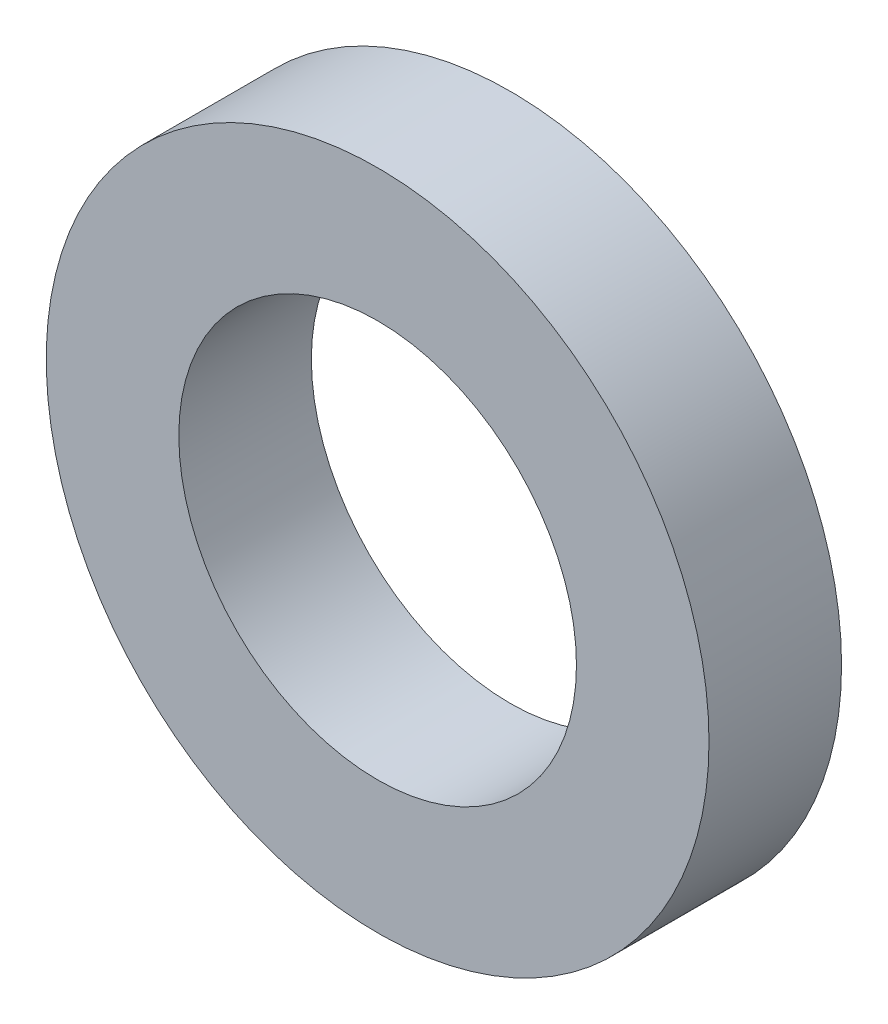
ISO-10303-21;
HEADER;
FILE_DESCRIPTION(('STEP AP214'),'2;1');
FILE_NAME('part.step','',(''),(''),'','','');
FILE_SCHEMA(('AUTOMOTIVE_DESIGN { 1 0 10303 214 1 1 1 1 }'));
ENDSEC;
DATA;
#1=APPLICATION_CONTEXT('core data for automotive mechanical design processes');
#2=APPLICATION_PROTOCOL_DEFINITION('international standard','automotive_design',2000,#1);
#3=PRODUCT_CONTEXT('',#1,'mechanical');
#4=PRODUCT('Part','Part','',(#3));
#5=PRODUCT_RELATED_PRODUCT_CATEGORY('part','',(#4));
#6=PRODUCT_DEFINITION_FORMATION('','',#4);
#7=PRODUCT_DEFINITION_CONTEXT('part definition',#1,'design');
#8=PRODUCT_DEFINITION('design','',#6,#7);
#9=PRODUCT_DEFINITION_SHAPE('','',#8);
#10=(LENGTH_UNIT() NAMED_UNIT(*) SI_UNIT(.MILLI.,.METRE.));
#11=(NAMED_UNIT(*) PLANE_ANGLE_UNIT() SI_UNIT($,.RADIAN.));
#12=(NAMED_UNIT(*) SI_UNIT($,.STERADIAN.) SOLID_ANGLE_UNIT());
#13=UNCERTAINTY_MEASURE_WITH_UNIT(LENGTH_MEASURE(1.E-05),#10,'distance_accuracy_value','');
#14=(GEOMETRIC_REPRESENTATION_CONTEXT(3) GLOBAL_UNCERTAINTY_ASSIGNED_CONTEXT((#13)) GLOBAL_UNIT_ASSIGNED_CONTEXT((#10,
#11,#12)) REPRESENTATION_CONTEXT('',''));
#15=CARTESIAN_POINT('',(0.,0.,0.));
#16=DIRECTION('',(0.,0.,1.));
#17=DIRECTION('',(1.,0.,0.));
#18=AXIS2_PLACEMENT_3D('',#15,#16,#17);
#19=CARTESIAN_POINT('',(0.,0.,3.));
#20=DIRECTION('',(0.,0.,1.));
#21=DIRECTION('',(1.,0.,0.));
#22=AXIS2_PLACEMENT_3D('',#19,#20,#21);
#23=PLANE('',#22);
#24=CARTESIAN_POINT('',(0.,0.,3.));
#25=DIRECTION('',(0.,0.,1.));
#26=DIRECTION('',(1.,0.,0.));
#27=AXIS2_PLACEMENT_3D('',#24,#25,#26);
#28=CIRCLE('',#27,7.5);
#29=CARTESIAN_POINT('',(7.5,0.,3.));
#30=VERTEX_POINT('',#29);
#31=EDGE_CURVE('E12',#30,#30,#28,.T.);
#32=ORIENTED_EDGE('',*,*,#31,.T.);
#33=EDGE_LOOP('',(#32));
#34=FACE_BOUND('',#33,.T.);
#35=CARTESIAN_POINT('',(0.,0.,3.));
#36=DIRECTION('',(0.,0.,1.));
#37=DIRECTION('',(1.,0.,0.));
#38=AXIS2_PLACEMENT_3D('',#35,#36,#37);
#39=CIRCLE('',#38,4.5);
#40=CARTESIAN_POINT('',(4.5,0.,3.));
#41=VERTEX_POINT('',#40);
#42=EDGE_CURVE('E55',#41,#41,#39,.T.);
#43=ORIENTED_EDGE('',*,*,#42,.F.);
#44=EDGE_LOOP('',(#43));
#45=FACE_BOUND('',#44,.T.);
#46=ADVANCED_FACE('F44',(#34,#45),#23,.T.);
#47=CARTESIAN_POINT('',(0.,0.,0.));
#48=DIRECTION('',(0.,0.,1.));
#49=DIRECTION('',(1.,0.,0.));
#50=AXIS2_PLACEMENT_3D('',#47,#48,#49);
#51=PLANE('',#50);
#52=CARTESIAN_POINT('',(0.,0.,0.));
#53=DIRECTION('',(0.,0.,1.));
#54=DIRECTION('',(1.,0.,0.));
#55=AXIS2_PLACEMENT_3D('',#52,#53,#54);
#56=CIRCLE('',#55,7.5);
#57=CARTESIAN_POINT('',(7.5,0.,0.));
#58=VERTEX_POINT('',#57);
#59=EDGE_CURVE('E48',#58,#58,#56,.T.);
#60=ORIENTED_EDGE('',*,*,#59,.F.);
#61=EDGE_LOOP('',(#60));
#62=FACE_BOUND('',#61,.T.);
#63=CARTESIAN_POINT('',(0.,0.,0.));
#64=DIRECTION('',(0.,0.,1.));
#65=DIRECTION('',(1.,0.,0.));
#66=AXIS2_PLACEMENT_3D('',#63,#64,#65);
#67=CIRCLE('',#66,4.5);
#68=CARTESIAN_POINT('',(4.5,0.,0.));
#69=VERTEX_POINT('',#68);
#70=EDGE_CURVE('E57',#69,#69,#67,.T.);
#71=ORIENTED_EDGE('',*,*,#70,.T.);
#72=EDGE_LOOP('',(#71));
#73=FACE_BOUND('',#72,.T.);
#74=ADVANCED_FACE('F67',(#62,#73),#51,.F.);
#75=CARTESIAN_POINT('',(0.,0.,3.));
#76=DIRECTION('',(0.,0.,-1.));
#77=DIRECTION('',(-1.,0.,0.));
#78=AXIS2_PLACEMENT_3D('',#75,#76,#77);
#79=CYLINDRICAL_SURFACE('',#78,7.5);
#80=ORIENTED_EDGE('',*,*,#31,.F.);
#81=EDGE_LOOP('',(#80));
#82=FACE_BOUND('',#81,.T.);
#83=ORIENTED_EDGE('',*,*,#59,.T.);
#84=EDGE_LOOP('',(#83));
#85=FACE_BOUND('',#84,.T.);
#86=ADVANCED_FACE('F46',(#82,#85),#79,.T.);
#87=CARTESIAN_POINT('',(0.,0.,3.));
#88=DIRECTION('',(0.,0.,-1.));
#89=DIRECTION('',(-1.,0.,0.));
#90=AXIS2_PLACEMENT_3D('',#87,#88,#89);
#91=CYLINDRICAL_SURFACE('',#90,4.5);
#92=ORIENTED_EDGE('',*,*,#42,.T.);
#93=EDGE_LOOP('',(#92));
#94=FACE_BOUND('',#93,.T.);
#95=ORIENTED_EDGE('',*,*,#70,.F.);
#96=EDGE_LOOP('',(#95));
#97=FACE_BOUND('',#96,.T.);
#98=ADVANCED_FACE('F63',(#94,#97),#91,.F.);
#99=CLOSED_SHELL('',(#46,#74,#86,#98));
#100=MANIFOLD_SOLID_BREP('B2',#99);
#101=ADVANCED_BREP_SHAPE_REPRESENTATION('',(#18,#100),#14);
#102=SHAPE_DEFINITION_REPRESENTATION(#9,#101);
ENDSEC;
END-ISO-10303-21;
